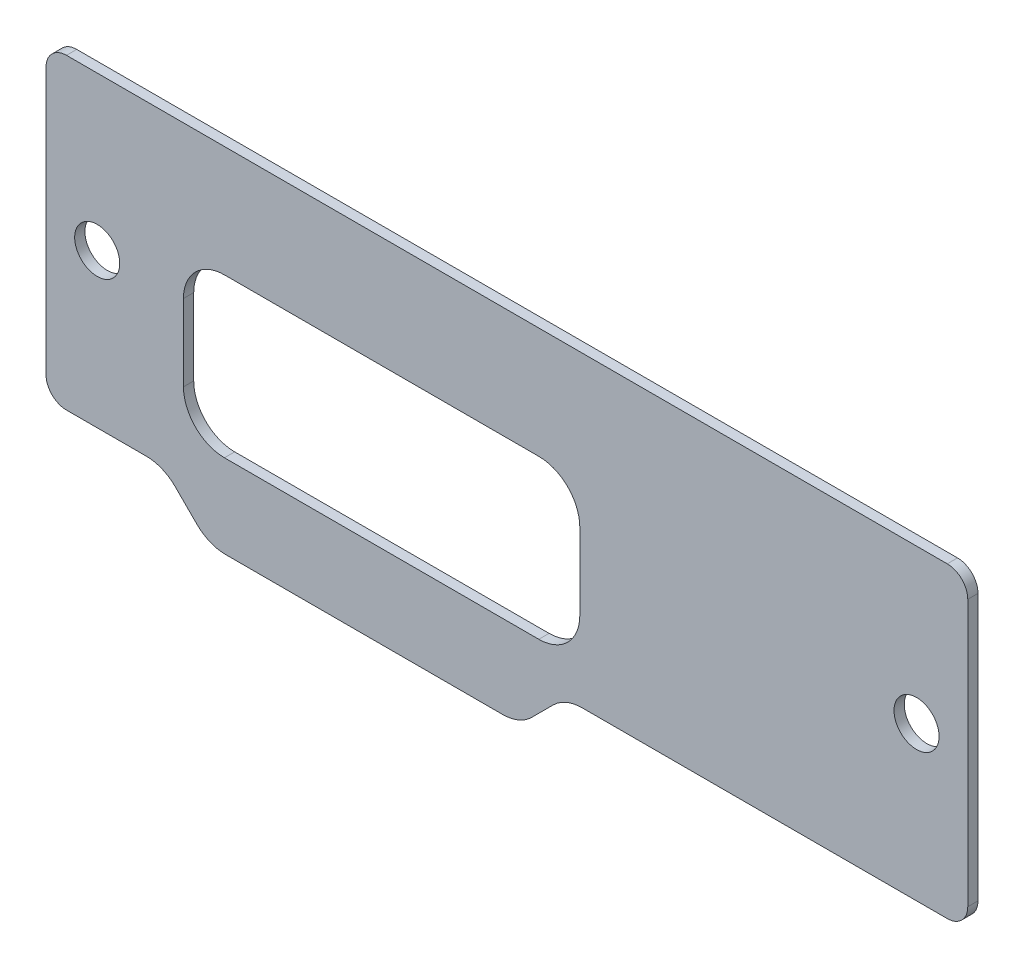
ISO-10303-21;
HEADER;
FILE_DESCRIPTION(('STEP AP214'),'2;1');
FILE_NAME('part.step','',(''),(''),'','','');
FILE_SCHEMA(('AUTOMOTIVE_DESIGN { 1 0 10303 214 1 1 1 1 }'));
ENDSEC;
DATA;
#1=APPLICATION_CONTEXT('core data for automotive mechanical design processes');
#2=APPLICATION_PROTOCOL_DEFINITION('international standard','automotive_design',2000,#1);
#3=PRODUCT_CONTEXT('',#1,'mechanical');
#4=PRODUCT('Part','Part','',(#3));
#5=PRODUCT_RELATED_PRODUCT_CATEGORY('part','',(#4));
#6=PRODUCT_DEFINITION_FORMATION('','',#4);
#7=PRODUCT_DEFINITION_CONTEXT('part definition',#1,'design');
#8=PRODUCT_DEFINITION('design','',#6,#7);
#9=PRODUCT_DEFINITION_SHAPE('','',#8);
#10=(LENGTH_UNIT() NAMED_UNIT(*) SI_UNIT(.MILLI.,.METRE.));
#11=(NAMED_UNIT(*) PLANE_ANGLE_UNIT() SI_UNIT($,.RADIAN.));
#12=(NAMED_UNIT(*) SI_UNIT($,.STERADIAN.) SOLID_ANGLE_UNIT());
#13=UNCERTAINTY_MEASURE_WITH_UNIT(LENGTH_MEASURE(1.E-05),#10,'distance_accuracy_value','');
#14=(GEOMETRIC_REPRESENTATION_CONTEXT(3) GLOBAL_UNCERTAINTY_ASSIGNED_CONTEXT((#13)) GLOBAL_UNIT_ASSIGNED_CONTEXT((#10,
#11,#12)) REPRESENTATION_CONTEXT('',''));
#15=CARTESIAN_POINT('',(0.,0.,0.));
#16=DIRECTION('',(0.,0.,1.));
#17=DIRECTION('',(1.,0.,0.));
#18=AXIS2_PLACEMENT_3D('',#15,#16,#17);
#19=CARTESIAN_POINT('',(-23.9884406525876,-3.16320030945431,0.5));
#20=DIRECTION('',(0.,1.,0.));
#21=DIRECTION('',(-1.,0.,0.));
#22=AXIS2_PLACEMENT_3D('',#19,#20,#21);
#23=PLANE('',#22);
#24=DIRECTION('',(1.,0.,0.));
#25=VECTOR('',#24,1.);
#26=CARTESIAN_POINT('',(-23.9884406525876,-3.16320030945431,0.5));
#27=LINE('',#26,#25);
#28=CARTESIAN_POINT('',(2.18763376843958,-3.1632003094543,0.5));
#29=VERTEX_POINT('',#28);
#30=CARTESIAN_POINT('',(20.0115593474124,-3.1632003094543,0.5));
#31=VERTEX_POINT('',#30);
#32=EDGE_CURVE('E373',#29,#31,#27,.T.);
#33=ORIENTED_EDGE('',*,*,#32,.F.);
#34=DIRECTION('',(0.,0.,-1.));
#35=VECTOR('',#34,1.);
#36=CARTESIAN_POINT('',(2.18763376843959,-3.1632003094543,0.5));
#37=LINE('',#36,#35);
#38=CARTESIAN_POINT('',(2.18763376843958,-3.1632003094543,0.));
#39=VERTEX_POINT('',#38);
#40=EDGE_CURVE('E314',#29,#39,#37,.T.);
#41=ORIENTED_EDGE('',*,*,#40,.T.);
#42=DIRECTION('',(1.,0.,0.));
#43=VECTOR('',#42,1.);
#44=CARTESIAN_POINT('',(-23.9884406525876,-3.16320030945431,0.));
#45=LINE('',#44,#43);
#46=CARTESIAN_POINT('',(20.0115593474124,-3.1632003094543,0.));
#47=VERTEX_POINT('',#46);
#48=EDGE_CURVE('E228',#39,#47,#45,.T.);
#49=ORIENTED_EDGE('',*,*,#48,.T.);
#50=DIRECTION('',(0.,0.,-1.));
#51=VECTOR('',#50,1.);
#52=CARTESIAN_POINT('',(20.0115593474124,-3.1632003094543,0.5));
#53=LINE('',#52,#51);
#54=EDGE_CURVE('E270',#47,#31,#53,.F.);
#55=ORIENTED_EDGE('',*,*,#54,.T.);
#56=EDGE_LOOP('',(#33,#41,#49,#55));
#57=FACE_BOUND('',#56,.T.);
#58=ADVANCED_FACE('F35',(#57),#23,.F.);
#59=CARTESIAN_POINT('',(0.,0.,0.5));
#60=DIRECTION('',(0.,0.,1.));
#61=DIRECTION('',(1.,0.,0.));
#62=AXIS2_PLACEMENT_3D('',#59,#60,#61);
#63=PLANE('',#62);
#64=DIRECTION('',(1.,0.,0.));
#65=VECTOR('',#64,1.);
#66=CARTESIAN_POINT('',(-16.0408149730745,-5.38649190676644,0.5));
#67=LINE('',#66,#65);
#68=CARTESIAN_POINT('',(-15.2123878483284,-5.38649190676644,0.5));
#69=VERTEX_POINT('',#68);
#70=CARTESIAN_POINT('',(-1.69251207836489,-5.3864919067664,0.5));
#71=VERTEX_POINT('',#70);
#72=EDGE_CURVE('E356',#69,#71,#67,.T.);
#73=ORIENTED_EDGE('',*,*,#72,.T.);
#74=CARTESIAN_POINT('',(-1.69251207836489,-3.3864919067664,0.5));
#75=DIRECTION('',(0.,0.,1.));
#76=DIRECTION('',(1.,0.,0.));
#77=AXIS2_PLACEMENT_3D('',#74,#75,#76);
#78=CIRCLE('',#77,2.);
#79=CARTESIAN_POINT('',(-0.278298515991804,-4.8007054691395,0.5));
#80=VERTEX_POINT('',#79);
#81=EDGE_CURVE('E328',#71,#80,#78,.T.);
#82=ORIENTED_EDGE('',*,*,#81,.T.);
#83=DIRECTION('',(0.707106781186549,0.707106781186546,0.));
#84=VECTOR('',#83,1.);
#85=CARTESIAN_POINT('',(-0.864084953618706,-5.3864919067664,0.5));
#86=LINE('',#85,#84);
#87=CARTESIAN_POINT('',(0.773420206066497,-3.74898674708121,0.5));
#88=VERTEX_POINT('',#87);
#89=EDGE_CURVE('E405',#80,#88,#86,.T.);
#90=ORIENTED_EDGE('',*,*,#89,.T.);
#91=CARTESIAN_POINT('',(2.18763376843959,-5.1632003094543,0.5));
#92=DIRECTION('',(0.,0.,1.));
#93=DIRECTION('',(1.,0.,0.));
#94=AXIS2_PLACEMENT_3D('',#91,#92,#93);
#95=CIRCLE('',#94,2.);
#96=EDGE_CURVE('E343',#88,#29,#95,.F.);
#97=ORIENTED_EDGE('',*,*,#96,.T.);
#98=ORIENTED_EDGE('',*,*,#32,.T.);
#99=CARTESIAN_POINT('',(20.0115593474124,-2.1632003094543,0.5));
#100=DIRECTION('',(0.,0.,1.));
#101=DIRECTION('',(1.,0.,0.));
#102=AXIS2_PLACEMENT_3D('',#99,#100,#101);
#103=CIRCLE('',#102,1.);
#104=CARTESIAN_POINT('',(21.0115593474124,-2.16320030945429,0.5));
#105=VERTEX_POINT('',#104);
#106=EDGE_CURVE('E263',#31,#105,#103,.T.);
#107=ORIENTED_EDGE('',*,*,#106,.T.);
#108=DIRECTION('',(0.,1.,0.));
#109=VECTOR('',#108,1.);
#110=CARTESIAN_POINT('',(21.0115593474124,11.8367996905457,0.5));
#111=LINE('',#110,#109);
#112=CARTESIAN_POINT('',(21.0115593474124,10.8367996905457,0.5));
#113=VERTEX_POINT('',#112);
#114=EDGE_CURVE('E236',#105,#113,#111,.T.);
#115=ORIENTED_EDGE('',*,*,#114,.T.);
#116=CARTESIAN_POINT('',(20.0115593474124,10.8367996905457,0.5));
#117=DIRECTION('',(0.,0.,1.));
#118=DIRECTION('',(1.,0.,0.));
#119=AXIS2_PLACEMENT_3D('',#116,#117,#118);
#120=CIRCLE('',#119,1.);
#121=CARTESIAN_POINT('',(20.0115593474124,11.8367996905457,0.5));
#122=VERTEX_POINT('',#121);
#123=EDGE_CURVE('E265',#113,#122,#120,.T.);
#124=ORIENTED_EDGE('',*,*,#123,.T.);
#125=DIRECTION('',(-1.,0.,0.));
#126=VECTOR('',#125,1.);
#127=CARTESIAN_POINT('',(-23.9884406525876,11.8367996905457,0.5));
#128=LINE('',#127,#126);
#129=CARTESIAN_POINT('',(-22.9884406525876,11.8367996905457,0.5));
#130=VERTEX_POINT('',#129);
#131=EDGE_CURVE('E216',#122,#130,#128,.T.);
#132=ORIENTED_EDGE('',*,*,#131,.T.);
#133=CARTESIAN_POINT('',(-22.9884406525876,10.8367996905457,0.5));
#134=DIRECTION('',(0.,0.,1.));
#135=DIRECTION('',(1.,0.,0.));
#136=AXIS2_PLACEMENT_3D('',#133,#134,#135);
#137=CIRCLE('',#136,1.);
#138=CARTESIAN_POINT('',(-23.9884406525876,10.8367996905457,0.5));
#139=VERTEX_POINT('',#138);
#140=EDGE_CURVE('E259',#130,#139,#137,.T.);
#141=ORIENTED_EDGE('',*,*,#140,.T.);
#142=DIRECTION('',(0.,-1.,0.));
#143=VECTOR('',#142,1.);
#144=CARTESIAN_POINT('',(-23.9884406525876,11.8367996905457,0.5));
#145=LINE('',#144,#143);
#146=CARTESIAN_POINT('',(-23.9884406525876,-2.16320030945431,0.5));
#147=VERTEX_POINT('',#146);
#148=EDGE_CURVE('E371',#139,#147,#145,.T.);
#149=ORIENTED_EDGE('',*,*,#148,.T.);
#150=CARTESIAN_POINT('',(-22.9884406525876,-2.16320030945431,0.5));
#151=DIRECTION('',(0.,0.,1.));
#152=DIRECTION('',(1.,0.,0.));
#153=AXIS2_PLACEMENT_3D('',#150,#151,#152);
#154=CIRCLE('',#153,1.);
#155=CARTESIAN_POINT('',(-22.9884406525876,-3.16320030945431,0.5));
#156=VERTEX_POINT('',#155);
#157=EDGE_CURVE('E261',#147,#156,#154,.T.);
#158=ORIENTED_EDGE('',*,*,#157,.T.);
#159=CARTESIAN_POINT('',(-19.0925336951329,-3.16320030945431,0.5));
#160=VERTEX_POINT('',#159);
#161=EDGE_CURVE('E241',#156,#160,#27,.T.);
#162=ORIENTED_EDGE('',*,*,#161,.T.);
#163=CARTESIAN_POINT('',(-19.0925336951329,-5.16320030945431,0.5));
#164=DIRECTION('',(0.,0.,1.));
#165=DIRECTION('',(1.,0.,0.));
#166=AXIS2_PLACEMENT_3D('',#163,#164,#165);
#167=CIRCLE('',#166,2.);
#168=CARTESIAN_POINT('',(-17.6783201327598,-3.7489867470812,0.5));
#169=VERTEX_POINT('',#168);
#170=EDGE_CURVE('E43',#160,#169,#167,.F.);
#171=ORIENTED_EDGE('',*,*,#170,.T.);
#172=DIRECTION('',(0.707106781186556,-0.707106781186539,0.));
#173=VECTOR('',#172,1.);
#174=CARTESIAN_POINT('',(-18.8396405091301,-2.58766637071099,0.5));
#175=LINE('',#174,#173);
#176=CARTESIAN_POINT('',(-16.6266014107014,-4.80070546913955,0.5));
#177=VERTEX_POINT('',#176);
#178=EDGE_CURVE('E350',#169,#177,#175,.T.);
#179=ORIENTED_EDGE('',*,*,#178,.T.);
#180=CARTESIAN_POINT('',(-15.2123878483284,-3.38649190676644,0.5));
#181=DIRECTION('',(0.,0.,1.));
#182=DIRECTION('',(1.,0.,0.));
#183=AXIS2_PLACEMENT_3D('',#180,#181,#182);
#184=CIRCLE('',#183,2.);
#185=EDGE_CURVE('E326',#177,#69,#184,.T.);
#186=ORIENTED_EDGE('',*,*,#185,.T.);
#187=EDGE_LOOP('',(#73,#82,#90,#97,#98,#107,#115,#124,#132,#141,#149,#158,#162,#171,#179,#186));
#188=FACE_BOUND('',#187,.T.);
#189=DIRECTION('',(0.,1.,0.));
#190=VECTOR('',#189,1.);
#191=CARTESIAN_POINT('',(2.07197520372589,6.40966960987009,0.5));
#192=LINE('',#191,#190);
#193=CARTESIAN_POINT('',(2.07197520372589,0.676475828944844,0.5));
#194=VERTEX_POINT('',#193);
#195=CARTESIAN_POINT('',(2.07197520372589,4.40966960987009,0.5));
#196=VERTEX_POINT('',#195);
#197=EDGE_CURVE('E399',#194,#196,#192,.T.);
#198=ORIENTED_EDGE('',*,*,#197,.F.);
#199=CARTESIAN_POINT('',(0.071975203725887,0.676475828944844,0.5));
#200=DIRECTION('',(0.,0.,1.));
#201=DIRECTION('',(1.,0.,0.));
#202=AXIS2_PLACEMENT_3D('',#199,#200,#201);
#203=CIRCLE('',#202,2.);
#204=CARTESIAN_POINT('',(0.0719752037258853,-1.32352417105516,0.5));
#205=VERTEX_POINT('',#204);
#206=EDGE_CURVE('E302',#194,#205,#203,.F.);
#207=ORIENTED_EDGE('',*,*,#206,.T.);
#208=DIRECTION('',(1.,0.,0.));
#209=VECTOR('',#208,1.);
#210=CARTESIAN_POINT('',(-17.2774271650427,-1.32352417105516,0.5));
#211=LINE('',#210,#209);
#212=CARTESIAN_POINT('',(-15.2774271650427,-1.32352417105516,0.5));
#213=VERTEX_POINT('',#212);
#214=EDGE_CURVE('E388',#213,#205,#211,.T.);
#215=ORIENTED_EDGE('',*,*,#214,.F.);
#216=CARTESIAN_POINT('',(-15.2774271650427,0.676475828944844,0.5));
#217=DIRECTION('',(0.,0.,1.));
#218=DIRECTION('',(1.,0.,0.));
#219=AXIS2_PLACEMENT_3D('',#216,#217,#218);
#220=CIRCLE('',#219,2.);
#221=CARTESIAN_POINT('',(-17.2774271650427,0.676475828944844,0.5));
#222=VERTEX_POINT('',#221);
#223=EDGE_CURVE('E306',#213,#222,#220,.F.);
#224=ORIENTED_EDGE('',*,*,#223,.T.);
#225=DIRECTION('',(0.,-1.,0.));
#226=VECTOR('',#225,1.);
#227=CARTESIAN_POINT('',(-17.2774271650427,6.40966960987009,0.5));
#228=LINE('',#227,#226);
#229=CARTESIAN_POINT('',(-17.2774271650427,4.40966960987009,0.5));
#230=VERTEX_POINT('',#229);
#231=EDGE_CURVE('E393',#230,#222,#228,.T.);
#232=ORIENTED_EDGE('',*,*,#231,.F.);
#233=CARTESIAN_POINT('',(-15.2774271650427,4.40966960987009,0.5));
#234=DIRECTION('',(0.,0.,1.));
#235=DIRECTION('',(1.,0.,0.));
#236=AXIS2_PLACEMENT_3D('',#233,#234,#235);
#237=CIRCLE('',#236,2.);
#238=CARTESIAN_POINT('',(-15.2774271650427,6.40966960987009,0.5));
#239=VERTEX_POINT('',#238);
#240=EDGE_CURVE('E310',#230,#239,#237,.F.);
#241=ORIENTED_EDGE('',*,*,#240,.T.);
#242=DIRECTION('',(-1.,0.,0.));
#243=VECTOR('',#242,1.);
#244=CARTESIAN_POINT('',(-17.2774271650427,6.40966960987009,0.5));
#245=LINE('',#244,#243);
#246=CARTESIAN_POINT('',(0.0719752037258853,6.40966960987009,0.5));
#247=VERTEX_POINT('',#246);
#248=EDGE_CURVE('E396',#247,#239,#245,.T.);
#249=ORIENTED_EDGE('',*,*,#248,.F.);
#250=CARTESIAN_POINT('',(0.0719752037258853,4.40966960987009,0.5));
#251=DIRECTION('',(0.,0.,1.));
#252=DIRECTION('',(1.,0.,0.));
#253=AXIS2_PLACEMENT_3D('',#250,#251,#252);
#254=CIRCLE('',#253,2.);
#255=EDGE_CURVE('E298',#247,#196,#254,.F.);
#256=ORIENTED_EDGE('',*,*,#255,.T.);
#257=EDGE_LOOP('',(#198,#207,#215,#224,#232,#241,#249,#256));
#258=FACE_BOUND('',#257,.T.);
#259=CARTESIAN_POINT('',(-21.4884406525876,4.33679969054569,0.5));
#260=DIRECTION('',(0.,0.,1.));
#261=DIRECTION('',(1.,0.,0.));
#262=AXIS2_PLACEMENT_3D('',#259,#260,#261);
#263=CIRCLE('',#262,1.1);
#264=CARTESIAN_POINT('',(-20.3884406525876,4.33679969054569,0.5));
#265=VERTEX_POINT('',#264);
#266=EDGE_CURVE('E230',#265,#265,#263,.T.);
#267=ORIENTED_EDGE('',*,*,#266,.F.);
#268=EDGE_LOOP('',(#267));
#269=FACE_BOUND('',#268,.T.);
#270=CARTESIAN_POINT('',(18.5115593474124,4.3367996905457,0.5));
#271=DIRECTION('',(0.,0.,1.));
#272=DIRECTION('',(1.,0.,0.));
#273=AXIS2_PLACEMENT_3D('',#270,#271,#272);
#274=CIRCLE('',#273,1.1);
#275=CARTESIAN_POINT('',(19.6115593474124,4.3367996905457,0.5));
#276=VERTEX_POINT('',#275);
#277=EDGE_CURVE('E382',#276,#276,#274,.T.);
#278=ORIENTED_EDGE('',*,*,#277,.F.);
#279=EDGE_LOOP('',(#278));
#280=FACE_BOUND('',#279,.T.);
#281=ADVANCED_FACE('F348',(#188,#258,#269,#280),#63,.T.);
#282=CARTESIAN_POINT('',(0.,0.,0.));
#283=DIRECTION('',(0.,0.,1.));
#284=DIRECTION('',(1.,0.,0.));
#285=AXIS2_PLACEMENT_3D('',#282,#283,#284);
#286=PLANE('',#285);
#287=DIRECTION('',(0.,-1.,0.));
#288=VECTOR('',#287,1.);
#289=CARTESIAN_POINT('',(-17.2774271650427,0.,0.));
#290=LINE('',#289,#288);
#291=CARTESIAN_POINT('',(-17.2774271650427,4.40966960987009,0.));
#292=VERTEX_POINT('',#291);
#293=CARTESIAN_POINT('',(-17.2774271650427,0.676475828944844,0.));
#294=VERTEX_POINT('',#293);
#295=EDGE_CURVE('E240',#292,#294,#290,.T.);
#296=ORIENTED_EDGE('',*,*,#295,.T.);
#297=CARTESIAN_POINT('',(-15.2774271650427,0.676475828944844,0.));
#298=DIRECTION('',(0.,0.,1.));
#299=DIRECTION('',(1.,0.,0.));
#300=AXIS2_PLACEMENT_3D('',#297,#298,#299);
#301=CIRCLE('',#300,2.);
#302=CARTESIAN_POINT('',(-15.2774271650427,-1.32352417105516,0.));
#303=VERTEX_POINT('',#302);
#304=EDGE_CURVE('E308',#294,#303,#301,.T.);
#305=ORIENTED_EDGE('',*,*,#304,.T.);
#306=DIRECTION('',(1.,0.,0.));
#307=VECTOR('',#306,1.);
#308=CARTESIAN_POINT('',(0.,-1.32352417105516,0.));
#309=LINE('',#308,#307);
#310=CARTESIAN_POINT('',(0.071975203725887,-1.32352417105516,0.));
#311=VERTEX_POINT('',#310);
#312=EDGE_CURVE('E244',#303,#311,#309,.T.);
#313=ORIENTED_EDGE('',*,*,#312,.T.);
#314=CARTESIAN_POINT('',(0.071975203725887,0.676475828944844,0.));
#315=DIRECTION('',(0.,0.,1.));
#316=DIRECTION('',(1.,0.,0.));
#317=AXIS2_PLACEMENT_3D('',#314,#315,#316);
#318=CIRCLE('',#317,2.);
#319=CARTESIAN_POINT('',(2.07197520372589,0.676475828944844,0.));
#320=VERTEX_POINT('',#319);
#321=EDGE_CURVE('E304',#311,#320,#318,.T.);
#322=ORIENTED_EDGE('',*,*,#321,.T.);
#323=DIRECTION('',(0.,1.,0.));
#324=VECTOR('',#323,1.);
#325=CARTESIAN_POINT('',(2.07197520372589,0.,0.));
#326=LINE('',#325,#324);
#327=CARTESIAN_POINT('',(2.07197520372589,4.40966960987009,0.));
#328=VERTEX_POINT('',#327);
#329=EDGE_CURVE('E247',#320,#328,#326,.T.);
#330=ORIENTED_EDGE('',*,*,#329,.T.);
#331=CARTESIAN_POINT('',(0.0719752037258853,4.40966960987009,0.));
#332=DIRECTION('',(0.,0.,1.));
#333=DIRECTION('',(1.,0.,0.));
#334=AXIS2_PLACEMENT_3D('',#331,#332,#333);
#335=CIRCLE('',#334,2.);
#336=CARTESIAN_POINT('',(0.0719752037258853,6.40966960987009,0.));
#337=VERTEX_POINT('',#336);
#338=EDGE_CURVE('E300',#328,#337,#335,.T.);
#339=ORIENTED_EDGE('',*,*,#338,.T.);
#340=DIRECTION('',(-1.,0.,0.));
#341=VECTOR('',#340,1.);
#342=CARTESIAN_POINT('',(0.,6.40966960987009,0.));
#343=LINE('',#342,#341);
#344=CARTESIAN_POINT('',(-15.2774271650427,6.40966960987009,0.));
#345=VERTEX_POINT('',#344);
#346=EDGE_CURVE('E237',#337,#345,#343,.T.);
#347=ORIENTED_EDGE('',*,*,#346,.T.);
#348=CARTESIAN_POINT('',(-15.2774271650427,4.40966960987009,0.));
#349=DIRECTION('',(0.,0.,1.));
#350=DIRECTION('',(1.,0.,0.));
#351=AXIS2_PLACEMENT_3D('',#348,#349,#350);
#352=CIRCLE('',#351,2.);
#353=EDGE_CURVE('E312',#345,#292,#352,.T.);
#354=ORIENTED_EDGE('',*,*,#353,.T.);
#355=EDGE_LOOP('',(#296,#305,#313,#322,#330,#339,#347,#354));
#356=FACE_BOUND('',#355,.T.);
#357=DIRECTION('',(-0.707106781186549,-0.707106781186546,0.));
#358=VECTOR('',#357,1.);
#359=CARTESIAN_POINT('',(-0.864084953618706,-5.3864919067664,0.));
#360=LINE('',#359,#358);
#361=CARTESIAN_POINT('',(0.773420206066498,-3.7489867470812,0.));
#362=VERTEX_POINT('',#361);
#363=CARTESIAN_POINT('',(-0.278298515991804,-4.8007054691395,0.));
#364=VERTEX_POINT('',#363);
#365=EDGE_CURVE('E404',#362,#364,#360,.T.);
#366=ORIENTED_EDGE('',*,*,#365,.T.);
#367=CARTESIAN_POINT('',(-1.69251207836489,-3.3864919067664,0.));
#368=DIRECTION('',(0.,0.,1.));
#369=DIRECTION('',(1.,0.,0.));
#370=AXIS2_PLACEMENT_3D('',#367,#368,#369);
#371=CIRCLE('',#370,2.);
#372=CARTESIAN_POINT('',(-1.69251207836489,-5.3864919067664,0.));
#373=VERTEX_POINT('',#372);
#374=EDGE_CURVE('E332',#364,#373,#371,.F.);
#375=ORIENTED_EDGE('',*,*,#374,.T.);
#376=DIRECTION('',(-1.,0.,0.));
#377=VECTOR('',#376,1.);
#378=CARTESIAN_POINT('',(-16.0408149730745,-5.38649190676644,0.));
#379=LINE('',#378,#377);
#380=CARTESIAN_POINT('',(-15.2123878483284,-5.38649190676644,0.));
#381=VERTEX_POINT('',#380);
#382=EDGE_CURVE('E408',#373,#381,#379,.T.);
#383=ORIENTED_EDGE('',*,*,#382,.T.);
#384=CARTESIAN_POINT('',(-15.2123878483284,-3.38649190676644,0.));
#385=DIRECTION('',(0.,0.,1.));
#386=DIRECTION('',(1.,0.,0.));
#387=AXIS2_PLACEMENT_3D('',#384,#385,#386);
#388=CIRCLE('',#387,2.);
#389=CARTESIAN_POINT('',(-16.6266014107014,-4.80070546913955,0.));
#390=VERTEX_POINT('',#389);
#391=EDGE_CURVE('E330',#381,#390,#388,.F.);
#392=ORIENTED_EDGE('',*,*,#391,.T.);
#393=DIRECTION('',(-0.707106781186556,0.707106781186539,0.));
#394=VECTOR('',#393,1.);
#395=CARTESIAN_POINT('',(-18.8396405091301,-2.58766637071099,0.));
#396=LINE('',#395,#394);
#397=CARTESIAN_POINT('',(-17.6783201327598,-3.7489867470812,0.));
#398=VERTEX_POINT('',#397);
#399=EDGE_CURVE('E402',#390,#398,#396,.T.);
#400=ORIENTED_EDGE('',*,*,#399,.T.);
#401=CARTESIAN_POINT('',(-19.0925336951329,-5.16320030945431,0.));
#402=DIRECTION('',(0.,0.,1.));
#403=DIRECTION('',(1.,0.,0.));
#404=AXIS2_PLACEMENT_3D('',#401,#402,#403);
#405=CIRCLE('',#404,2.);
#406=CARTESIAN_POINT('',(-19.0925336951329,-3.16320030945431,0.));
#407=VERTEX_POINT('',#406);
#408=EDGE_CURVE('E11',#398,#407,#405,.T.);
#409=ORIENTED_EDGE('',*,*,#408,.T.);
#410=CARTESIAN_POINT('',(-22.9884406525876,-3.16320030945431,0.));
#411=VERTEX_POINT('',#410);
#412=EDGE_CURVE('E234',#411,#407,#45,.T.);
#413=ORIENTED_EDGE('',*,*,#412,.F.);
#414=CARTESIAN_POINT('',(-22.9884406525876,-2.16320030945431,0.));
#415=DIRECTION('',(0.,0.,1.));
#416=DIRECTION('',(1.,0.,0.));
#417=AXIS2_PLACEMENT_3D('',#414,#415,#416);
#418=CIRCLE('',#417,1.);
#419=CARTESIAN_POINT('',(-23.9884406525876,-2.16320030945431,0.));
#420=VERTEX_POINT('',#419);
#421=EDGE_CURVE('E252',#411,#420,#418,.F.);
#422=ORIENTED_EDGE('',*,*,#421,.T.);
#423=DIRECTION('',(0.,-1.,0.));
#424=VECTOR('',#423,1.);
#425=CARTESIAN_POINT('',(-23.9884406525876,11.8367996905457,0.));
#426=LINE('',#425,#424);
#427=CARTESIAN_POINT('',(-23.9884406525876,10.8367996905457,0.));
#428=VERTEX_POINT('',#427);
#429=EDGE_CURVE('E224',#428,#420,#426,.T.);
#430=ORIENTED_EDGE('',*,*,#429,.F.);
#431=CARTESIAN_POINT('',(-22.9884406525876,10.8367996905457,0.));
#432=DIRECTION('',(0.,0.,1.));
#433=DIRECTION('',(1.,0.,0.));
#434=AXIS2_PLACEMENT_3D('',#431,#432,#433);
#435=CIRCLE('',#434,1.);
#436=CARTESIAN_POINT('',(-22.9884406525876,11.8367996905457,0.));
#437=VERTEX_POINT('',#436);
#438=EDGE_CURVE('E217',#428,#437,#435,.F.);
#439=ORIENTED_EDGE('',*,*,#438,.T.);
#440=DIRECTION('',(-1.,0.,0.));
#441=VECTOR('',#440,1.);
#442=CARTESIAN_POINT('',(-23.9884406525876,11.8367996905457,0.));
#443=LINE('',#442,#441);
#444=CARTESIAN_POINT('',(20.0115593474124,11.8367996905457,0.));
#445=VERTEX_POINT('',#444);
#446=EDGE_CURVE('E213',#445,#437,#443,.T.);
#447=ORIENTED_EDGE('',*,*,#446,.F.);
#448=CARTESIAN_POINT('',(20.0115593474124,10.8367996905457,0.));
#449=DIRECTION('',(0.,0.,1.));
#450=DIRECTION('',(1.,0.,0.));
#451=AXIS2_PLACEMENT_3D('',#448,#449,#450);
#452=CIRCLE('',#451,1.);
#453=CARTESIAN_POINT('',(21.0115593474124,10.8367996905457,0.));
#454=VERTEX_POINT('',#453);
#455=EDGE_CURVE('E197',#445,#454,#452,.F.);
#456=ORIENTED_EDGE('',*,*,#455,.T.);
#457=DIRECTION('',(0.,1.,0.));
#458=VECTOR('',#457,1.);
#459=CARTESIAN_POINT('',(21.0115593474124,11.8367996905457,0.));
#460=LINE('',#459,#458);
#461=CARTESIAN_POINT('',(21.0115593474124,-2.16320030945429,0.));
#462=VERTEX_POINT('',#461);
#463=EDGE_CURVE('E225',#462,#454,#460,.T.);
#464=ORIENTED_EDGE('',*,*,#463,.F.);
#465=CARTESIAN_POINT('',(20.0115593474124,-2.1632003094543,0.));
#466=DIRECTION('',(0.,0.,1.));
#467=DIRECTION('',(1.,0.,0.));
#468=AXIS2_PLACEMENT_3D('',#465,#466,#467);
#469=CIRCLE('',#468,1.);
#470=EDGE_CURVE('E207',#462,#47,#469,.F.);
#471=ORIENTED_EDGE('',*,*,#470,.T.);
#472=ORIENTED_EDGE('',*,*,#48,.F.);
#473=CARTESIAN_POINT('',(2.18763376843959,-5.1632003094543,0.));
#474=DIRECTION('',(0.,0.,1.));
#475=DIRECTION('',(1.,0.,0.));
#476=AXIS2_PLACEMENT_3D('',#473,#474,#475);
#477=CIRCLE('',#476,2.);
#478=EDGE_CURVE('E341',#39,#362,#477,.T.);
#479=ORIENTED_EDGE('',*,*,#478,.T.);
#480=EDGE_LOOP('',(#366,#375,#383,#392,#400,#409,#413,#422,#430,#439,#447,#456,#464,#471,#472,#479));
#481=FACE_BOUND('',#480,.T.);
#482=CARTESIAN_POINT('',(-21.4884406525876,4.33679969054569,0.));
#483=DIRECTION('',(0.,0.,1.));
#484=DIRECTION('',(1.,0.,0.));
#485=AXIS2_PLACEMENT_3D('',#482,#483,#484);
#486=CIRCLE('',#485,1.1);
#487=CARTESIAN_POINT('',(-20.3884406525876,4.33679969054569,0.));
#488=VERTEX_POINT('',#487);
#489=EDGE_CURVE('E379',#488,#488,#486,.T.);
#490=ORIENTED_EDGE('',*,*,#489,.T.);
#491=EDGE_LOOP('',(#490));
#492=FACE_BOUND('',#491,.T.);
#493=CARTESIAN_POINT('',(18.5115593474124,4.3367996905457,0.));
#494=DIRECTION('',(0.,0.,1.));
#495=DIRECTION('',(1.,0.,0.));
#496=AXIS2_PLACEMENT_3D('',#493,#494,#495);
#497=CIRCLE('',#496,1.1);
#498=CARTESIAN_POINT('',(19.6115593474124,4.3367996905457,0.));
#499=VERTEX_POINT('',#498);
#500=EDGE_CURVE('E385',#499,#499,#497,.T.);
#501=ORIENTED_EDGE('',*,*,#500,.T.);
#502=EDGE_LOOP('',(#501));
#503=FACE_BOUND('',#502,.T.);
#504=ADVANCED_FACE('F221',(#356,#481,#492,#503),#286,.F.);
#505=CARTESIAN_POINT('',(21.0115593474124,11.8367996905457,0.5));
#506=DIRECTION('',(-1.,0.,0.));
#507=DIRECTION('',(0.,-1.,0.));
#508=AXIS2_PLACEMENT_3D('',#505,#506,#507);
#509=PLANE('',#508);
#510=ORIENTED_EDGE('',*,*,#463,.T.);
#511=DIRECTION('',(0.,0.,-1.));
#512=VECTOR('',#511,1.);
#513=CARTESIAN_POINT('',(21.0115593474124,10.8367996905457,0.5));
#514=LINE('',#513,#512);
#515=EDGE_CURVE('E202',#454,#113,#514,.F.);
#516=ORIENTED_EDGE('',*,*,#515,.T.);
#517=ORIENTED_EDGE('',*,*,#114,.F.);
#518=DIRECTION('',(0.,0.,-1.));
#519=VECTOR('',#518,1.);
#520=CARTESIAN_POINT('',(21.0115593474124,-2.1632003094543,0.5));
#521=LINE('',#520,#519);
#522=EDGE_CURVE('E206',#105,#462,#521,.T.);
#523=ORIENTED_EDGE('',*,*,#522,.T.);
#524=EDGE_LOOP('',(#510,#516,#517,#523));
#525=FACE_BOUND('',#524,.T.);
#526=ADVANCED_FACE('F443',(#525),#509,.F.);
#527=CARTESIAN_POINT('',(-23.9884406525876,11.8367996905457,0.5));
#528=DIRECTION('',(0.,-1.,0.));
#529=DIRECTION('',(1.,0.,0.));
#530=AXIS2_PLACEMENT_3D('',#527,#528,#529);
#531=PLANE('',#530);
#532=ORIENTED_EDGE('',*,*,#131,.F.);
#533=DIRECTION('',(0.,0.,-1.));
#534=VECTOR('',#533,1.);
#535=CARTESIAN_POINT('',(20.0115593474124,11.8367996905457,0.5));
#536=LINE('',#535,#534);
#537=EDGE_CURVE('E201',#122,#445,#536,.T.);
#538=ORIENTED_EDGE('',*,*,#537,.T.);
#539=ORIENTED_EDGE('',*,*,#446,.T.);
#540=DIRECTION('',(0.,0.,-1.));
#541=VECTOR('',#540,1.);
#542=CARTESIAN_POINT('',(-22.9884406525876,11.8367996905457,0.5));
#543=LINE('',#542,#541);
#544=EDGE_CURVE('E218',#437,#130,#543,.F.);
#545=ORIENTED_EDGE('',*,*,#544,.T.);
#546=EDGE_LOOP('',(#532,#538,#539,#545));
#547=FACE_BOUND('',#546,.T.);
#548=ADVANCED_FACE('F212',(#547),#531,.F.);
#549=CARTESIAN_POINT('',(-23.9884406525876,11.8367996905457,0.5));
#550=DIRECTION('',(1.,0.,0.));
#551=DIRECTION('',(0.,1.,0.));
#552=AXIS2_PLACEMENT_3D('',#549,#550,#551);
#553=PLANE('',#552);
#554=ORIENTED_EDGE('',*,*,#429,.T.);
#555=DIRECTION('',(0.,0.,-1.));
#556=VECTOR('',#555,1.);
#557=CARTESIAN_POINT('',(-23.9884406525876,-2.16320030945431,0.5));
#558=LINE('',#557,#556);
#559=EDGE_CURVE('E276',#420,#147,#558,.F.);
#560=ORIENTED_EDGE('',*,*,#559,.T.);
#561=ORIENTED_EDGE('',*,*,#148,.F.);
#562=DIRECTION('',(0.,0.,-1.));
#563=VECTOR('',#562,1.);
#564=CARTESIAN_POINT('',(-23.9884406525876,10.8367996905457,0.5));
#565=LINE('',#564,#563);
#566=EDGE_CURVE('E273',#139,#428,#565,.T.);
#567=ORIENTED_EDGE('',*,*,#566,.T.);
#568=EDGE_LOOP('',(#554,#560,#561,#567));
#569=FACE_BOUND('',#568,.T.);
#570=ADVANCED_FACE('F365',(#569),#553,.F.);
#571=ORIENTED_EDGE('',*,*,#412,.T.);
#572=DIRECTION('',(0.,0.,1.));
#573=VECTOR('',#572,1.);
#574=CARTESIAN_POINT('',(-19.0925336951329,-3.16320030945431,0.5));
#575=LINE('',#574,#573);
#576=EDGE_CURVE('E334',#407,#160,#575,.T.);
#577=ORIENTED_EDGE('',*,*,#576,.T.);
#578=ORIENTED_EDGE('',*,*,#161,.F.);
#579=DIRECTION('',(0.,0.,-1.));
#580=VECTOR('',#579,1.);
#581=CARTESIAN_POINT('',(-22.9884406525876,-3.16320030945431,0.5));
#582=LINE('',#581,#580);
#583=EDGE_CURVE('E267',#156,#411,#582,.T.);
#584=ORIENTED_EDGE('',*,*,#583,.T.);
#585=EDGE_LOOP('',(#571,#577,#578,#584));
#586=FACE_BOUND('',#585,.T.);
#587=ADVANCED_FACE('F360',(#586),#23,.F.);
#588=CARTESIAN_POINT('',(-21.4884406525876,4.33679969054569,0.5));
#589=DIRECTION('',(0.,0.,-1.));
#590=DIRECTION('',(-1.,0.,0.));
#591=AXIS2_PLACEMENT_3D('',#588,#589,#590);
#592=CYLINDRICAL_SURFACE('',#591,1.1);
#593=ORIENTED_EDGE('',*,*,#266,.T.);
#594=EDGE_LOOP('',(#593));
#595=FACE_BOUND('',#594,.T.);
#596=ORIENTED_EDGE('',*,*,#489,.F.);
#597=EDGE_LOOP('',(#596));
#598=FACE_BOUND('',#597,.T.);
#599=ADVANCED_FACE('F462',(#595,#598),#592,.F.);
#600=CARTESIAN_POINT('',(18.5115593474124,4.3367996905457,0.5));
#601=DIRECTION('',(0.,0.,-1.));
#602=DIRECTION('',(-1.,0.,0.));
#603=AXIS2_PLACEMENT_3D('',#600,#601,#602);
#604=CYLINDRICAL_SURFACE('',#603,1.1);
#605=ORIENTED_EDGE('',*,*,#277,.T.);
#606=EDGE_LOOP('',(#605));
#607=FACE_BOUND('',#606,.T.);
#608=ORIENTED_EDGE('',*,*,#500,.F.);
#609=EDGE_LOOP('',(#608));
#610=FACE_BOUND('',#609,.T.);
#611=ADVANCED_FACE('F467',(#607,#610),#604,.F.);
#612=CARTESIAN_POINT('',(2.07197520372589,6.40966960987009,-1.));
#613=DIRECTION('',(1.,0.,0.));
#614=DIRECTION('',(0.,0.,-1.));
#615=AXIS2_PLACEMENT_3D('',#612,#613,#614);
#616=PLANE('',#615);
#617=ORIENTED_EDGE('',*,*,#197,.T.);
#618=DIRECTION('',(0.,0.,1.));
#619=VECTOR('',#618,1.);
#620=CARTESIAN_POINT('',(2.07197520372589,4.40966960987009,0.));
#621=LINE('',#620,#619);
#622=EDGE_CURVE('E286',#196,#328,#621,.F.);
#623=ORIENTED_EDGE('',*,*,#622,.T.);
#624=ORIENTED_EDGE('',*,*,#329,.F.);
#625=DIRECTION('',(0.,0.,1.));
#626=VECTOR('',#625,1.);
#627=CARTESIAN_POINT('',(2.07197520372589,0.676475828944844,0.5));
#628=LINE('',#627,#626);
#629=EDGE_CURVE('E283',#320,#194,#628,.T.);
#630=ORIENTED_EDGE('',*,*,#629,.T.);
#631=EDGE_LOOP('',(#617,#623,#624,#630));
#632=FACE_BOUND('',#631,.T.);
#633=ADVANCED_FACE('F491',(#632),#616,.F.);
#634=CARTESIAN_POINT('',(-17.2774271650427,-1.32352417105516,-1.));
#635=DIRECTION('',(0.,-1.,0.));
#636=DIRECTION('',(0.,0.,-1.));
#637=AXIS2_PLACEMENT_3D('',#634,#635,#636);
#638=PLANE('',#637);
#639=ORIENTED_EDGE('',*,*,#214,.T.);
#640=DIRECTION('',(0.,0.,1.));
#641=VECTOR('',#640,1.);
#642=CARTESIAN_POINT('',(0.071975203725887,-1.32352417105516,0.));
#643=LINE('',#642,#641);
#644=EDGE_CURVE('E291',#205,#311,#643,.F.);
#645=ORIENTED_EDGE('',*,*,#644,.T.);
#646=ORIENTED_EDGE('',*,*,#312,.F.);
#647=DIRECTION('',(0.,0.,1.));
#648=VECTOR('',#647,1.);
#649=CARTESIAN_POINT('',(-15.2774271650427,-1.32352417105516,0.5));
#650=LINE('',#649,#648);
#651=EDGE_CURVE('E288',#303,#213,#650,.T.);
#652=ORIENTED_EDGE('',*,*,#651,.T.);
#653=EDGE_LOOP('',(#639,#645,#646,#652));
#654=FACE_BOUND('',#653,.T.);
#655=ADVANCED_FACE('F602',(#654),#638,.F.);
#656=CARTESIAN_POINT('',(-17.2774271650427,6.40966960987009,-1.));
#657=DIRECTION('',(-1.,0.,0.));
#658=DIRECTION('',(0.,0.,1.));
#659=AXIS2_PLACEMENT_3D('',#656,#657,#658);
#660=PLANE('',#659);
#661=ORIENTED_EDGE('',*,*,#231,.T.);
#662=DIRECTION('',(0.,0.,1.));
#663=VECTOR('',#662,1.);
#664=CARTESIAN_POINT('',(-17.2774271650427,0.676475828944844,0.));
#665=LINE('',#664,#663);
#666=EDGE_CURVE('E296',#222,#294,#665,.F.);
#667=ORIENTED_EDGE('',*,*,#666,.T.);
#668=ORIENTED_EDGE('',*,*,#295,.F.);
#669=DIRECTION('',(0.,0.,1.));
#670=VECTOR('',#669,1.);
#671=CARTESIAN_POINT('',(-17.2774271650427,4.40966960987009,0.5));
#672=LINE('',#671,#670);
#673=EDGE_CURVE('E293',#292,#230,#672,.T.);
#674=ORIENTED_EDGE('',*,*,#673,.T.);
#675=EDGE_LOOP('',(#661,#667,#668,#674));
#676=FACE_BOUND('',#675,.T.);
#677=ADVANCED_FACE('F596',(#676),#660,.F.);
#678=CARTESIAN_POINT('',(-17.2774271650427,6.40966960987009,-1.));
#679=DIRECTION('',(0.,1.,0.));
#680=DIRECTION('',(0.,0.,1.));
#681=AXIS2_PLACEMENT_3D('',#678,#679,#680);
#682=PLANE('',#681);
#683=ORIENTED_EDGE('',*,*,#346,.F.);
#684=DIRECTION('',(0.,0.,1.));
#685=VECTOR('',#684,1.);
#686=CARTESIAN_POINT('',(0.0719752037258853,6.40966960987009,0.5));
#687=LINE('',#686,#685);
#688=EDGE_CURVE('E280',#337,#247,#687,.T.);
#689=ORIENTED_EDGE('',*,*,#688,.T.);
#690=ORIENTED_EDGE('',*,*,#248,.T.);
#691=DIRECTION('',(0.,0.,1.));
#692=VECTOR('',#691,1.);
#693=CARTESIAN_POINT('',(-15.2774271650427,6.40966960987009,0.));
#694=LINE('',#693,#692);
#695=EDGE_CURVE('E278',#239,#345,#694,.F.);
#696=ORIENTED_EDGE('',*,*,#695,.T.);
#697=EDGE_LOOP('',(#683,#689,#690,#696));
#698=FACE_BOUND('',#697,.T.);
#699=ADVANCED_FACE('F593',(#698),#682,.F.);
#700=CARTESIAN_POINT('',(20.0115593474124,10.8367996905457,0.5));
#701=DIRECTION('',(0.,0.,-1.));
#702=DIRECTION('',(-1.,0.,0.));
#703=AXIS2_PLACEMENT_3D('',#700,#701,#702);
#704=CYLINDRICAL_SURFACE('',#703,1.);
#705=ORIENTED_EDGE('',*,*,#123,.F.);
#706=ORIENTED_EDGE('',*,*,#515,.F.);
#707=ORIENTED_EDGE('',*,*,#455,.F.);
#708=ORIENTED_EDGE('',*,*,#537,.F.);
#709=EDGE_LOOP('',(#705,#706,#707,#708));
#710=FACE_BOUND('',#709,.T.);
#711=ADVANCED_FACE('F200',(#710),#704,.T.);
#712=CARTESIAN_POINT('',(20.0115593474124,-2.1632003094543,0.5));
#713=DIRECTION('',(0.,0.,-1.));
#714=DIRECTION('',(-1.,0.,0.));
#715=AXIS2_PLACEMENT_3D('',#712,#713,#714);
#716=CYLINDRICAL_SURFACE('',#715,1.);
#717=ORIENTED_EDGE('',*,*,#106,.F.);
#718=ORIENTED_EDGE('',*,*,#54,.F.);
#719=ORIENTED_EDGE('',*,*,#470,.F.);
#720=ORIENTED_EDGE('',*,*,#522,.F.);
#721=EDGE_LOOP('',(#717,#718,#719,#720));
#722=FACE_BOUND('',#721,.T.);
#723=ADVANCED_FACE('F440',(#722),#716,.T.);
#724=CARTESIAN_POINT('',(-22.9884406525876,-2.16320030945431,0.5));
#725=DIRECTION('',(0.,0.,-1.));
#726=DIRECTION('',(-1.,0.,0.));
#727=AXIS2_PLACEMENT_3D('',#724,#725,#726);
#728=CYLINDRICAL_SURFACE('',#727,1.);
#729=ORIENTED_EDGE('',*,*,#157,.F.);
#730=ORIENTED_EDGE('',*,*,#559,.F.);
#731=ORIENTED_EDGE('',*,*,#421,.F.);
#732=ORIENTED_EDGE('',*,*,#583,.F.);
#733=EDGE_LOOP('',(#729,#730,#731,#732));
#734=FACE_BOUND('',#733,.T.);
#735=ADVANCED_FACE('F370',(#734),#728,.T.);
#736=CARTESIAN_POINT('',(-22.9884406525876,10.8367996905457,0.5));
#737=DIRECTION('',(0.,0.,-1.));
#738=DIRECTION('',(-1.,0.,0.));
#739=AXIS2_PLACEMENT_3D('',#736,#737,#738);
#740=CYLINDRICAL_SURFACE('',#739,1.);
#741=ORIENTED_EDGE('',*,*,#140,.F.);
#742=ORIENTED_EDGE('',*,*,#544,.F.);
#743=ORIENTED_EDGE('',*,*,#438,.F.);
#744=ORIENTED_EDGE('',*,*,#566,.F.);
#745=EDGE_LOOP('',(#741,#742,#743,#744));
#746=FACE_BOUND('',#745,.T.);
#747=ADVANCED_FACE('F584',(#746),#740,.T.);
#748=CARTESIAN_POINT('',(0.0719752037258853,4.40966960987009,-1.));
#749=DIRECTION('',(0.,0.,-1.));
#750=DIRECTION('',(-1.,0.,0.));
#751=AXIS2_PLACEMENT_3D('',#748,#749,#750);
#752=CYLINDRICAL_SURFACE('',#751,2.);
#753=ORIENTED_EDGE('',*,*,#338,.F.);
#754=ORIENTED_EDGE('',*,*,#622,.F.);
#755=ORIENTED_EDGE('',*,*,#255,.F.);
#756=ORIENTED_EDGE('',*,*,#688,.F.);
#757=EDGE_LOOP('',(#753,#754,#755,#756));
#758=FACE_BOUND('',#757,.T.);
#759=ADVANCED_FACE('F580',(#758),#752,.F.);
#760=CARTESIAN_POINT('',(0.071975203725887,0.676475828944844,-1.));
#761=DIRECTION('',(0.,0.,-1.));
#762=DIRECTION('',(-1.,0.,0.));
#763=AXIS2_PLACEMENT_3D('',#760,#761,#762);
#764=CYLINDRICAL_SURFACE('',#763,2.);
#765=ORIENTED_EDGE('',*,*,#321,.F.);
#766=ORIENTED_EDGE('',*,*,#644,.F.);
#767=ORIENTED_EDGE('',*,*,#206,.F.);
#768=ORIENTED_EDGE('',*,*,#629,.F.);
#769=EDGE_LOOP('',(#765,#766,#767,#768));
#770=FACE_BOUND('',#769,.T.);
#771=ADVANCED_FACE('F576',(#770),#764,.F.);
#772=CARTESIAN_POINT('',(-15.2774271650427,0.676475828944844,-1.));
#773=DIRECTION('',(0.,0.,-1.));
#774=DIRECTION('',(-1.,0.,0.));
#775=AXIS2_PLACEMENT_3D('',#772,#773,#774);
#776=CYLINDRICAL_SURFACE('',#775,2.);
#777=ORIENTED_EDGE('',*,*,#304,.F.);
#778=ORIENTED_EDGE('',*,*,#666,.F.);
#779=ORIENTED_EDGE('',*,*,#223,.F.);
#780=ORIENTED_EDGE('',*,*,#651,.F.);
#781=EDGE_LOOP('',(#777,#778,#779,#780));
#782=FACE_BOUND('',#781,.T.);
#783=ADVANCED_FACE('F572',(#782),#776,.F.);
#784=CARTESIAN_POINT('',(-15.2774271650427,4.40966960987009,-1.));
#785=DIRECTION('',(0.,0.,-1.));
#786=DIRECTION('',(-1.,0.,0.));
#787=AXIS2_PLACEMENT_3D('',#784,#785,#786);
#788=CYLINDRICAL_SURFACE('',#787,2.);
#789=ORIENTED_EDGE('',*,*,#353,.F.);
#790=ORIENTED_EDGE('',*,*,#695,.F.);
#791=ORIENTED_EDGE('',*,*,#240,.F.);
#792=ORIENTED_EDGE('',*,*,#673,.F.);
#793=EDGE_LOOP('',(#789,#790,#791,#792));
#794=FACE_BOUND('',#793,.T.);
#795=ADVANCED_FACE('F519',(#794),#788,.F.);
#796=CARTESIAN_POINT('',(-0.864084953618706,-5.3864919067664,-22.0493845656625));
#797=DIRECTION('',(0.707106781186546,-0.707106781186549,0.));
#798=DIRECTION('',(0.707106781186549,0.707106781186546,0.));
#799=AXIS2_PLACEMENT_3D('',#796,#797,#798);
#800=PLANE('',#799);
#801=ORIENTED_EDGE('',*,*,#365,.F.);
#802=DIRECTION('',(0.,0.,-1.));
#803=VECTOR('',#802,1.);
#804=CARTESIAN_POINT('',(0.773420206066498,-3.74898674708121,-22.0493845656625));
#805=LINE('',#804,#803);
#806=EDGE_CURVE('E319',#362,#88,#805,.F.);
#807=ORIENTED_EDGE('',*,*,#806,.T.);
#808=ORIENTED_EDGE('',*,*,#89,.F.);
#809=DIRECTION('',(0.,0.,1.));
#810=VECTOR('',#809,1.);
#811=CARTESIAN_POINT('',(-0.278298515991804,-4.8007054691395,-22.0493845656625));
#812=LINE('',#811,#810);
#813=EDGE_CURVE('E317',#80,#364,#812,.F.);
#814=ORIENTED_EDGE('',*,*,#813,.T.);
#815=EDGE_LOOP('',(#801,#807,#808,#814));
#816=FACE_BOUND('',#815,.T.);
#817=ADVANCED_FACE('F428',(#816),#800,.T.);
#818=CARTESIAN_POINT('',(-18.8396405091301,-2.58766637071099,-22.0493845656625));
#819=DIRECTION('',(-0.707106781186539,-0.707106781186556,0.));
#820=DIRECTION('',(0.707106781186556,-0.707106781186539,0.));
#821=AXIS2_PLACEMENT_3D('',#818,#819,#820);
#822=PLANE('',#821);
#823=ORIENTED_EDGE('',*,*,#178,.F.);
#824=DIRECTION('',(0.,0.,1.));
#825=VECTOR('',#824,1.);
#826=CARTESIAN_POINT('',(-17.6783201327598,-3.74898674708119,-22.0493845656625));
#827=LINE('',#826,#825);
#828=EDGE_CURVE('E56',#169,#398,#827,.F.);
#829=ORIENTED_EDGE('',*,*,#828,.T.);
#830=ORIENTED_EDGE('',*,*,#399,.F.);
#831=DIRECTION('',(0.,0.,1.));
#832=VECTOR('',#831,1.);
#833=CARTESIAN_POINT('',(-16.6266014107014,-4.80070546913955,-22.0493845656625));
#834=LINE('',#833,#832);
#835=EDGE_CURVE('E337',#390,#177,#834,.T.);
#836=ORIENTED_EDGE('',*,*,#835,.T.);
#837=EDGE_LOOP('',(#823,#829,#830,#836));
#838=FACE_BOUND('',#837,.T.);
#839=ADVANCED_FACE('F354',(#838),#822,.T.);
#840=CARTESIAN_POINT('',(-16.0408149730745,-5.38649190676644,-22.0493845656625));
#841=DIRECTION('',(0.,-1.,0.));
#842=DIRECTION('',(1.,0.,0.));
#843=AXIS2_PLACEMENT_3D('',#840,#841,#842);
#844=PLANE('',#843);
#845=ORIENTED_EDGE('',*,*,#382,.F.);
#846=DIRECTION('',(0.,0.,1.));
#847=VECTOR('',#846,1.);
#848=CARTESIAN_POINT('',(-1.69251207836489,-5.3864919067664,-22.0493845656625));
#849=LINE('',#848,#847);
#850=EDGE_CURVE('E323',#373,#71,#849,.T.);
#851=ORIENTED_EDGE('',*,*,#850,.T.);
#852=ORIENTED_EDGE('',*,*,#72,.F.);
#853=DIRECTION('',(0.,0.,1.));
#854=VECTOR('',#853,1.);
#855=CARTESIAN_POINT('',(-15.2123878483284,-5.38649190676644,-22.0493845656625));
#856=LINE('',#855,#854);
#857=EDGE_CURVE('E321',#69,#381,#856,.F.);
#858=ORIENTED_EDGE('',*,*,#857,.T.);
#859=EDGE_LOOP('',(#845,#851,#852,#858));
#860=FACE_BOUND('',#859,.T.);
#861=ADVANCED_FACE('F420',(#860),#844,.T.);
#862=CARTESIAN_POINT('',(2.18763376843959,-5.1632003094543,0.5));
#863=DIRECTION('',(0.,0.,-1.));
#864=DIRECTION('',(-1.,0.,0.));
#865=AXIS2_PLACEMENT_3D('',#862,#863,#864);
#866=CYLINDRICAL_SURFACE('',#865,2.);
#867=ORIENTED_EDGE('',*,*,#96,.F.);
#868=ORIENTED_EDGE('',*,*,#806,.F.);
#869=ORIENTED_EDGE('',*,*,#478,.F.);
#870=ORIENTED_EDGE('',*,*,#40,.F.);
#871=EDGE_LOOP('',(#867,#868,#869,#870));
#872=FACE_BOUND('',#871,.T.);
#873=ADVANCED_FACE('F431',(#872),#866,.F.);
#874=CARTESIAN_POINT('',(-1.69251207836489,-3.3864919067664,-22.0493845656625));
#875=DIRECTION('',(0.,0.,1.));
#876=DIRECTION('',(1.,0.,0.));
#877=AXIS2_PLACEMENT_3D('',#874,#875,#876);
#878=CYLINDRICAL_SURFACE('',#877,2.);
#879=ORIENTED_EDGE('',*,*,#374,.F.);
#880=ORIENTED_EDGE('',*,*,#813,.F.);
#881=ORIENTED_EDGE('',*,*,#81,.F.);
#882=ORIENTED_EDGE('',*,*,#850,.F.);
#883=EDGE_LOOP('',(#879,#880,#881,#882));
#884=FACE_BOUND('',#883,.T.);
#885=ADVANCED_FACE('F422',(#884),#878,.T.);
#886=CARTESIAN_POINT('',(-19.0925336951329,-5.16320030945431,0.5));
#887=DIRECTION('',(0.,0.,1.));
#888=DIRECTION('',(1.,0.,0.));
#889=AXIS2_PLACEMENT_3D('',#886,#887,#888);
#890=CYLINDRICAL_SURFACE('',#889,2.);
#891=ORIENTED_EDGE('',*,*,#408,.F.);
#892=ORIENTED_EDGE('',*,*,#828,.F.);
#893=ORIENTED_EDGE('',*,*,#170,.F.);
#894=ORIENTED_EDGE('',*,*,#576,.F.);
#895=EDGE_LOOP('',(#891,#892,#893,#894));
#896=FACE_BOUND('',#895,.T.);
#897=ADVANCED_FACE('F358',(#896),#890,.F.);
#898=CARTESIAN_POINT('',(-15.2123878483284,-3.38649190676644,-22.0493845656625));
#899=DIRECTION('',(0.,0.,1.));
#900=DIRECTION('',(1.,0.,0.));
#901=AXIS2_PLACEMENT_3D('',#898,#899,#900);
#902=CYLINDRICAL_SURFACE('',#901,2.);
#903=ORIENTED_EDGE('',*,*,#391,.F.);
#904=ORIENTED_EDGE('',*,*,#857,.F.);
#905=ORIENTED_EDGE('',*,*,#185,.F.);
#906=ORIENTED_EDGE('',*,*,#835,.F.);
#907=EDGE_LOOP('',(#903,#904,#905,#906));
#908=FACE_BOUND('',#907,.T.);
#909=ADVANCED_FACE('F37',(#908),#902,.T.);
#910=CLOSED_SHELL('',(#58,#281,#504,#526,#548,#570,#587,#599,#611,#633,#655,#677,#699,#711,#723,
#735,#747,#759,#771,#783,#795,#817,#839,#861,#873,#885,#897,#909));
#911=MANIFOLD_SOLID_BREP('B2',#910);
#912=ADVANCED_BREP_SHAPE_REPRESENTATION('',(#18,#911),#14);
#913=SHAPE_DEFINITION_REPRESENTATION(#9,#912);
ENDSEC;
END-ISO-10303-21;
